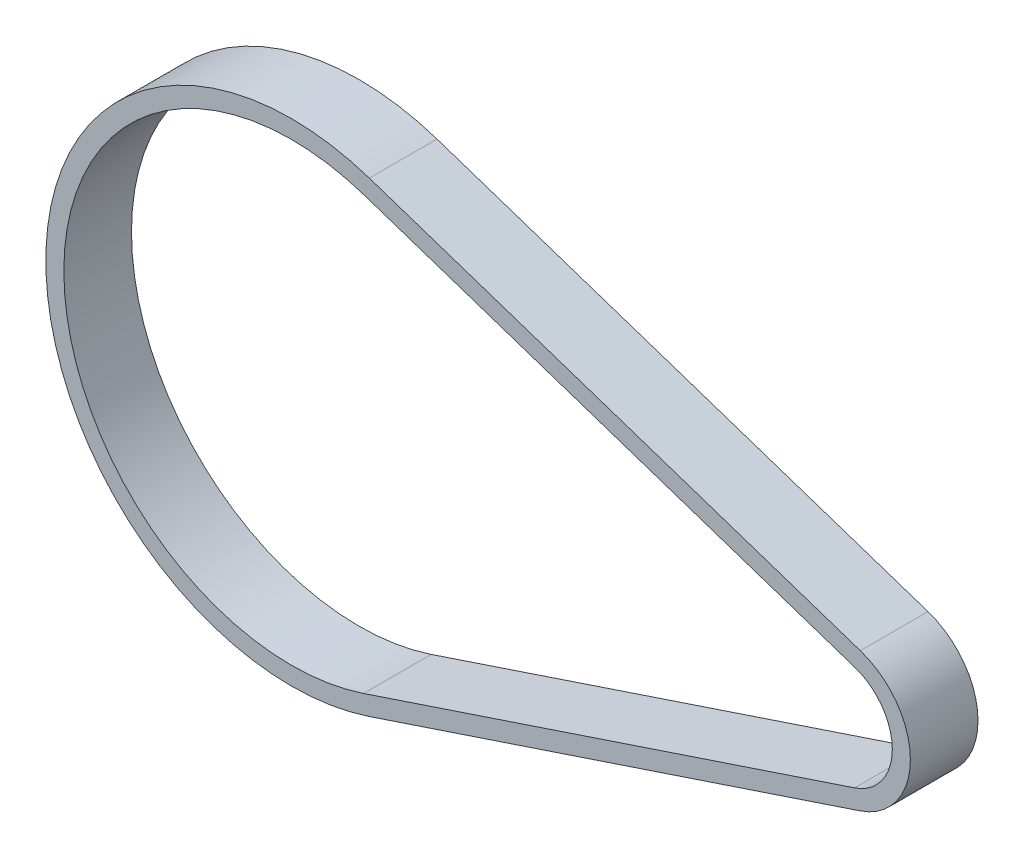
ISO-10303-21;
HEADER;
FILE_DESCRIPTION(('STEP AP214'),'2;1');
FILE_NAME('part.step','',(''),(''),'','','');
FILE_SCHEMA(('AUTOMOTIVE_DESIGN { 1 0 10303 214 1 1 1 1 }'));
ENDSEC;
DATA;
#1=APPLICATION_CONTEXT('core data for automotive mechanical design processes');
#2=APPLICATION_PROTOCOL_DEFINITION('international standard','automotive_design',2000,#1);
#3=PRODUCT_CONTEXT('',#1,'mechanical');
#4=PRODUCT('Part','Part','',(#3));
#5=PRODUCT_RELATED_PRODUCT_CATEGORY('part','',(#4));
#6=PRODUCT_DEFINITION_FORMATION('','',#4);
#7=PRODUCT_DEFINITION_CONTEXT('part definition',#1,'design');
#8=PRODUCT_DEFINITION('design','',#6,#7);
#9=PRODUCT_DEFINITION_SHAPE('','',#8);
#10=(LENGTH_UNIT() NAMED_UNIT(*) SI_UNIT(.MILLI.,.METRE.));
#11=(NAMED_UNIT(*) PLANE_ANGLE_UNIT() SI_UNIT($,.RADIAN.));
#12=(NAMED_UNIT(*) SI_UNIT($,.STERADIAN.) SOLID_ANGLE_UNIT());
#13=UNCERTAINTY_MEASURE_WITH_UNIT(LENGTH_MEASURE(1.E-05),#10,'distance_accuracy_value','');
#14=(GEOMETRIC_REPRESENTATION_CONTEXT(3) GLOBAL_UNCERTAINTY_ASSIGNED_CONTEXT((#13)) GLOBAL_UNIT_ASSIGNED_CONTEXT((#10,
#11,#12)) REPRESENTATION_CONTEXT('',''));
#15=CARTESIAN_POINT('',(0.,0.,0.));
#16=DIRECTION('',(0.,0.,1.));
#17=DIRECTION('',(1.,0.,0.));
#18=AXIS2_PLACEMENT_3D('',#15,#16,#17);
#19=CARTESIAN_POINT('',(-22.75,0.,7.5));
#20=DIRECTION('',(0.,0.,1.));
#21=DIRECTION('',(1.,0.,0.));
#22=AXIS2_PLACEMENT_3D('',#19,#20,#21);
#23=PLANE('',#22);
#24=CARTESIAN_POINT('',(-22.75,0.,7.5));
#25=DIRECTION('',(0.,0.,1.));
#26=DIRECTION('',(1.,0.,0.));
#27=AXIS2_PLACEMENT_3D('',#24,#25,#26);
#28=CIRCLE('',#27,27.25);
#29=CARTESIAN_POINT('',(-14.1290909090909,25.8503854216196,7.5));
#30=VERTEX_POINT('',#29);
#31=CARTESIAN_POINT('',(-14.1290909090909,-25.8503854216196,7.5));
#32=VERTEX_POINT('',#31);
#33=EDGE_CURVE('E153',#30,#32,#28,.T.);
#34=ORIENTED_EDGE('',*,*,#33,.T.);
#35=DIRECTION('',(0.948637997123653,0.316363636363636,0.));
#36=VECTOR('',#35,1.);
#37=CARTESIAN_POINT('',(40.3157090909091,-7.69345415667283,7.5));
#38=LINE('',#37,#36);
#39=CARTESIAN_POINT('',(40.3157090909091,-7.69345415667282,7.5));
#40=VERTEX_POINT('',#39);
#41=EDGE_CURVE('E157',#32,#40,#38,.T.);
#42=ORIENTED_EDGE('',*,*,#41,.T.);
#43=CARTESIAN_POINT('',(37.75,0.,7.5));
#44=DIRECTION('',(0.,0.,1.));
#45=DIRECTION('',(-1.,0.,0.));
#46=AXIS2_PLACEMENT_3D('',#43,#44,#45);
#47=CIRCLE('',#46,8.11);
#48=CARTESIAN_POINT('',(40.3157090909091,7.69345415667282,7.5));
#49=VERTEX_POINT('',#48);
#50=EDGE_CURVE('E161',#40,#49,#47,.T.);
#51=ORIENTED_EDGE('',*,*,#50,.T.);
#52=DIRECTION('',(-0.948637997123653,0.316363636363637,0.));
#53=VECTOR('',#52,1.);
#54=CARTESIAN_POINT('',(-14.1290909090909,25.8503854216196,7.5));
#55=LINE('',#54,#53);
#56=EDGE_CURVE('E164',#49,#30,#55,.T.);
#57=ORIENTED_EDGE('',*,*,#56,.T.);
#58=EDGE_LOOP('',(#34,#42,#51,#57));
#59=FACE_BOUND('',#58,.T.);
#60=DIRECTION('',(-0.948637997123653,0.316363636363636,0.));
#61=VECTOR('',#60,1.);
#62=CARTESIAN_POINT('',(39.6829818181818,5.79617816242553,7.5));
#63=LINE('',#62,#61);
#64=CARTESIAN_POINT('',(39.6829818181818,5.79617816242553,7.5));
#65=VERTEX_POINT('',#64);
#66=CARTESIAN_POINT('',(-14.7618181818182,23.9531094273723,7.5));
#67=VERTEX_POINT('',#66);
#68=EDGE_CURVE('E114',#65,#67,#63,.T.);
#69=ORIENTED_EDGE('',*,*,#68,.F.);
#70=CARTESIAN_POINT('',(37.75,0.,7.5));
#71=DIRECTION('',(0.,0.,1.));
#72=DIRECTION('',(-1.,0.,0.));
#73=AXIS2_PLACEMENT_3D('',#70,#71,#72);
#74=CIRCLE('',#73,6.11000000000001);
#75=CARTESIAN_POINT('',(39.6829818181818,-5.79617816242553,7.5));
#76=VERTEX_POINT('',#75);
#77=EDGE_CURVE('E105',#76,#65,#74,.T.);
#78=ORIENTED_EDGE('',*,*,#77,.F.);
#79=DIRECTION('',(0.948637997123654,0.316363636363636,0.));
#80=VECTOR('',#79,1.);
#81=CARTESIAN_POINT('',(-14.7618181818182,-23.9531094273722,7.5));
#82=LINE('',#81,#80);
#83=CARTESIAN_POINT('',(-14.7618181818182,-23.9531094273722,7.5));
#84=VERTEX_POINT('',#83);
#85=EDGE_CURVE('E131',#84,#76,#82,.T.);
#86=ORIENTED_EDGE('',*,*,#85,.F.);
#87=CARTESIAN_POINT('',(-22.75,0.,7.5));
#88=DIRECTION('',(0.,0.,1.));
#89=DIRECTION('',(1.,0.,0.));
#90=AXIS2_PLACEMENT_3D('',#87,#88,#89);
#91=CIRCLE('',#90,25.25);
#92=EDGE_CURVE('E127',#67,#84,#91,.T.);
#93=ORIENTED_EDGE('',*,*,#92,.F.);
#94=EDGE_LOOP('',(#69,#78,#86,#93));
#95=FACE_BOUND('',#94,.T.);
#96=ADVANCED_FACE('F39',(#59,#95),#23,.T.);
#97=CARTESIAN_POINT('',(-22.75,0.,0.));
#98=DIRECTION('',(0.,0.,1.));
#99=DIRECTION('',(1.,0.,0.));
#100=AXIS2_PLACEMENT_3D('',#97,#98,#99);
#101=PLANE('',#100);
#102=CARTESIAN_POINT('',(-22.75,0.,0.));
#103=DIRECTION('',(0.,0.,1.));
#104=DIRECTION('',(1.,0.,0.));
#105=AXIS2_PLACEMENT_3D('',#102,#103,#104);
#106=CIRCLE('',#105,27.25);
#107=CARTESIAN_POINT('',(-14.1290909090909,25.8503854216196,0.));
#108=VERTEX_POINT('',#107);
#109=CARTESIAN_POINT('',(-14.1290909090909,-25.8503854216196,0.));
#110=VERTEX_POINT('',#109);
#111=EDGE_CURVE('E123',#108,#110,#106,.T.);
#112=ORIENTED_EDGE('',*,*,#111,.F.);
#113=DIRECTION('',(-0.948637997123653,0.316363636363637,0.));
#114=VECTOR('',#113,1.);
#115=CARTESIAN_POINT('',(-14.1290909090909,25.8503854216196,0.));
#116=LINE('',#115,#114);
#117=CARTESIAN_POINT('',(40.3157090909091,7.69345415667282,0.));
#118=VERTEX_POINT('',#117);
#119=EDGE_CURVE('E158',#118,#108,#116,.T.);
#120=ORIENTED_EDGE('',*,*,#119,.F.);
#121=CARTESIAN_POINT('',(37.75,0.,0.));
#122=DIRECTION('',(0.,0.,1.));
#123=DIRECTION('',(-1.,0.,0.));
#124=AXIS2_PLACEMENT_3D('',#121,#122,#123);
#125=CIRCLE('',#124,8.11);
#126=CARTESIAN_POINT('',(40.3157090909091,-7.69345415667282,0.));
#127=VERTEX_POINT('',#126);
#128=EDGE_CURVE('E174',#127,#118,#125,.T.);
#129=ORIENTED_EDGE('',*,*,#128,.F.);
#130=DIRECTION('',(0.948637997123653,0.316363636363636,0.));
#131=VECTOR('',#130,1.);
#132=CARTESIAN_POINT('',(40.3157090909091,-7.69345415667283,0.));
#133=LINE('',#132,#131);
#134=EDGE_CURVE('E171',#110,#127,#133,.T.);
#135=ORIENTED_EDGE('',*,*,#134,.F.);
#136=EDGE_LOOP('',(#112,#120,#129,#135));
#137=FACE_BOUND('',#136,.T.);
#138=CARTESIAN_POINT('',(37.75,0.,0.));
#139=DIRECTION('',(0.,0.,1.));
#140=DIRECTION('',(-1.,0.,0.));
#141=AXIS2_PLACEMENT_3D('',#138,#139,#140);
#142=CIRCLE('',#141,6.11000000000001);
#143=CARTESIAN_POINT('',(39.6829818181818,-5.79617816242553,0.));
#144=VERTEX_POINT('',#143);
#145=CARTESIAN_POINT('',(39.6829818181818,5.79617816242553,0.));
#146=VERTEX_POINT('',#145);
#147=EDGE_CURVE('E63',#144,#146,#142,.T.);
#148=ORIENTED_EDGE('',*,*,#147,.T.);
#149=DIRECTION('',(-0.948637997123653,0.316363636363636,0.));
#150=VECTOR('',#149,1.);
#151=CARTESIAN_POINT('',(39.6829818181818,5.79617816242553,0.));
#152=LINE('',#151,#150);
#153=CARTESIAN_POINT('',(-14.7618181818182,23.9531094273723,0.));
#154=VERTEX_POINT('',#153);
#155=EDGE_CURVE('E121',#146,#154,#152,.T.);
#156=ORIENTED_EDGE('',*,*,#155,.T.);
#157=CARTESIAN_POINT('',(-22.75,0.,0.));
#158=DIRECTION('',(0.,0.,1.));
#159=DIRECTION('',(1.,0.,0.));
#160=AXIS2_PLACEMENT_3D('',#157,#158,#159);
#161=CIRCLE('',#160,25.25);
#162=CARTESIAN_POINT('',(-14.7618181818182,-23.9531094273723,0.));
#163=VERTEX_POINT('',#162);
#164=EDGE_CURVE('E140',#154,#163,#161,.T.);
#165=ORIENTED_EDGE('',*,*,#164,.T.);
#166=DIRECTION('',(0.948637997123654,0.316363636363636,0.));
#167=VECTOR('',#166,1.);
#168=CARTESIAN_POINT('',(-14.7618181818182,-23.9531094273722,0.));
#169=LINE('',#168,#167);
#170=EDGE_CURVE('E115',#163,#144,#169,.T.);
#171=ORIENTED_EDGE('',*,*,#170,.T.);
#172=EDGE_LOOP('',(#148,#156,#165,#171));
#173=FACE_BOUND('',#172,.T.);
#174=ADVANCED_FACE('F197',(#137,#173),#101,.F.);
#175=CARTESIAN_POINT('',(-22.75,0.,7.5));
#176=DIRECTION('',(0.,0.,-1.));
#177=DIRECTION('',(-1.,0.,0.));
#178=AXIS2_PLACEMENT_3D('',#175,#176,#177);
#179=CYLINDRICAL_SURFACE('',#178,27.25);
#180=ORIENTED_EDGE('',*,*,#111,.T.);
#181=DIRECTION('',(0.,0.,-1.));
#182=VECTOR('',#181,1.);
#183=CARTESIAN_POINT('',(-14.1290909090909,-25.8503854216196,7.5));
#184=LINE('',#183,#182);
#185=EDGE_CURVE('E11',#32,#110,#184,.T.);
#186=ORIENTED_EDGE('',*,*,#185,.F.);
#187=ORIENTED_EDGE('',*,*,#33,.F.);
#188=DIRECTION('',(0.,0.,-1.));
#189=VECTOR('',#188,1.);
#190=CARTESIAN_POINT('',(-14.1290909090909,25.8503854216196,7.5));
#191=LINE('',#190,#189);
#192=EDGE_CURVE('E167',#30,#108,#191,.T.);
#193=ORIENTED_EDGE('',*,*,#192,.T.);
#194=EDGE_LOOP('',(#180,#186,#187,#193));
#195=FACE_BOUND('',#194,.T.);
#196=ADVANCED_FACE('F41',(#195),#179,.T.);
#197=CARTESIAN_POINT('',(40.3157090909091,-7.69345415667283,7.5));
#198=DIRECTION('',(-0.316363636363636,0.948637997123653,0.));
#199=DIRECTION('',(-0.948637997123654,-0.316363636363636,0.));
#200=AXIS2_PLACEMENT_3D('',#197,#198,#199);
#201=PLANE('',#200);
#202=ORIENTED_EDGE('',*,*,#134,.T.);
#203=DIRECTION('',(0.,0.,-1.));
#204=VECTOR('',#203,1.);
#205=CARTESIAN_POINT('',(40.3157090909091,-7.69345415667282,7.5));
#206=LINE('',#205,#204);
#207=EDGE_CURVE('E48',#40,#127,#206,.T.);
#208=ORIENTED_EDGE('',*,*,#207,.F.);
#209=ORIENTED_EDGE('',*,*,#41,.F.);
#210=ORIENTED_EDGE('',*,*,#185,.T.);
#211=EDGE_LOOP('',(#202,#208,#209,#210));
#212=FACE_BOUND('',#211,.T.);
#213=ADVANCED_FACE('F207',(#212),#201,.F.);
#214=CARTESIAN_POINT('',(37.75,0.,7.5));
#215=DIRECTION('',(0.,0.,-1.));
#216=DIRECTION('',(-1.,0.,0.));
#217=AXIS2_PLACEMENT_3D('',#214,#215,#216);
#218=CYLINDRICAL_SURFACE('',#217,8.11);
#219=ORIENTED_EDGE('',*,*,#128,.T.);
#220=DIRECTION('',(0.,0.,-1.));
#221=VECTOR('',#220,1.);
#222=CARTESIAN_POINT('',(40.3157090909091,7.69345415667282,7.5));
#223=LINE('',#222,#221);
#224=EDGE_CURVE('E182',#49,#118,#223,.T.);
#225=ORIENTED_EDGE('',*,*,#224,.F.);
#226=ORIENTED_EDGE('',*,*,#50,.F.);
#227=ORIENTED_EDGE('',*,*,#207,.T.);
#228=EDGE_LOOP('',(#219,#225,#226,#227));
#229=FACE_BOUND('',#228,.T.);
#230=ADVANCED_FACE('F191',(#229),#218,.T.);
#231=CARTESIAN_POINT('',(-14.1290909090909,25.8503854216196,7.5));
#232=DIRECTION('',(-0.316363636363637,-0.948637997123653,0.));
#233=DIRECTION('',(0.948637997123654,-0.316363636363637,0.));
#234=AXIS2_PLACEMENT_3D('',#231,#232,#233);
#235=PLANE('',#234);
#236=ORIENTED_EDGE('',*,*,#119,.T.);
#237=ORIENTED_EDGE('',*,*,#192,.F.);
#238=ORIENTED_EDGE('',*,*,#56,.F.);
#239=ORIENTED_EDGE('',*,*,#224,.T.);
#240=EDGE_LOOP('',(#236,#237,#238,#239));
#241=FACE_BOUND('',#240,.T.);
#242=ADVANCED_FACE('F201',(#241),#235,.F.);
#243=CARTESIAN_POINT('',(37.75,0.,7.5));
#244=DIRECTION('',(0.,0.,-1.));
#245=DIRECTION('',(-1.,0.,0.));
#246=AXIS2_PLACEMENT_3D('',#243,#244,#245);
#247=CYLINDRICAL_SURFACE('',#246,6.11000000000001);
#248=ORIENTED_EDGE('',*,*,#147,.F.);
#249=DIRECTION('',(0.,0.,-1.));
#250=VECTOR('',#249,1.);
#251=CARTESIAN_POINT('',(39.6829818181818,-5.79617816242553,7.5));
#252=LINE('',#251,#250);
#253=EDGE_CURVE('E109',#76,#144,#252,.T.);
#254=ORIENTED_EDGE('',*,*,#253,.F.);
#255=ORIENTED_EDGE('',*,*,#77,.T.);
#256=DIRECTION('',(0.,0.,-1.));
#257=VECTOR('',#256,1.);
#258=CARTESIAN_POINT('',(39.6829818181818,5.79617816242553,7.5));
#259=LINE('',#258,#257);
#260=EDGE_CURVE('E108',#65,#146,#259,.T.);
#261=ORIENTED_EDGE('',*,*,#260,.T.);
#262=EDGE_LOOP('',(#248,#254,#255,#261));
#263=FACE_BOUND('',#262,.T.);
#264=ADVANCED_FACE('F107',(#263),#247,.F.);
#265=CARTESIAN_POINT('',(39.6829818181818,5.79617816242553,7.5));
#266=DIRECTION('',(-0.316363636363636,-0.948637997123653,0.));
#267=DIRECTION('',(0.948637997123654,-0.316363636363636,0.));
#268=AXIS2_PLACEMENT_3D('',#265,#266,#267);
#269=PLANE('',#268);
#270=ORIENTED_EDGE('',*,*,#155,.F.);
#271=ORIENTED_EDGE('',*,*,#260,.F.);
#272=ORIENTED_EDGE('',*,*,#68,.T.);
#273=DIRECTION('',(0.,0.,-1.));
#274=VECTOR('',#273,1.);
#275=CARTESIAN_POINT('',(-14.7618181818182,23.9531094273723,7.5));
#276=LINE('',#275,#274);
#277=EDGE_CURVE('E124',#67,#154,#276,.T.);
#278=ORIENTED_EDGE('',*,*,#277,.T.);
#279=EDGE_LOOP('',(#270,#271,#272,#278));
#280=FACE_BOUND('',#279,.T.);
#281=ADVANCED_FACE('F118',(#280),#269,.T.);
#282=CARTESIAN_POINT('',(-22.75,0.,7.5));
#283=DIRECTION('',(0.,0.,-1.));
#284=DIRECTION('',(-1.,0.,0.));
#285=AXIS2_PLACEMENT_3D('',#282,#283,#284);
#286=CYLINDRICAL_SURFACE('',#285,25.25);
#287=ORIENTED_EDGE('',*,*,#164,.F.);
#288=ORIENTED_EDGE('',*,*,#277,.F.);
#289=ORIENTED_EDGE('',*,*,#92,.T.);
#290=DIRECTION('',(0.,0.,-1.));
#291=VECTOR('',#290,1.);
#292=CARTESIAN_POINT('',(-14.7618181818182,-23.9531094273723,7.5));
#293=LINE('',#292,#291);
#294=EDGE_CURVE('E55',#84,#163,#293,.T.);
#295=ORIENTED_EDGE('',*,*,#294,.T.);
#296=EDGE_LOOP('',(#287,#288,#289,#295));
#297=FACE_BOUND('',#296,.T.);
#298=ADVANCED_FACE('F230',(#297),#286,.F.);
#299=CARTESIAN_POINT('',(-14.7618181818182,-23.9531094273722,7.5));
#300=DIRECTION('',(-0.316363636363636,0.948637997123654,0.));
#301=DIRECTION('',(-0.948637997123654,-0.316363636363636,0.));
#302=AXIS2_PLACEMENT_3D('',#299,#300,#301);
#303=PLANE('',#302);
#304=ORIENTED_EDGE('',*,*,#170,.F.);
#305=ORIENTED_EDGE('',*,*,#294,.F.);
#306=ORIENTED_EDGE('',*,*,#85,.T.);
#307=ORIENTED_EDGE('',*,*,#253,.T.);
#308=EDGE_LOOP('',(#304,#305,#306,#307));
#309=FACE_BOUND('',#308,.T.);
#310=ADVANCED_FACE('F234',(#309),#303,.T.);
#311=CLOSED_SHELL('',(#96,#174,#196,#213,#230,#242,#264,#281,#298,#310));
#312=MANIFOLD_SOLID_BREP('B2',#311);
#313=ADVANCED_BREP_SHAPE_REPRESENTATION('',(#18,#312),#14);
#314=SHAPE_DEFINITION_REPRESENTATION(#9,#313);
ENDSEC;
END-ISO-10303-21;
